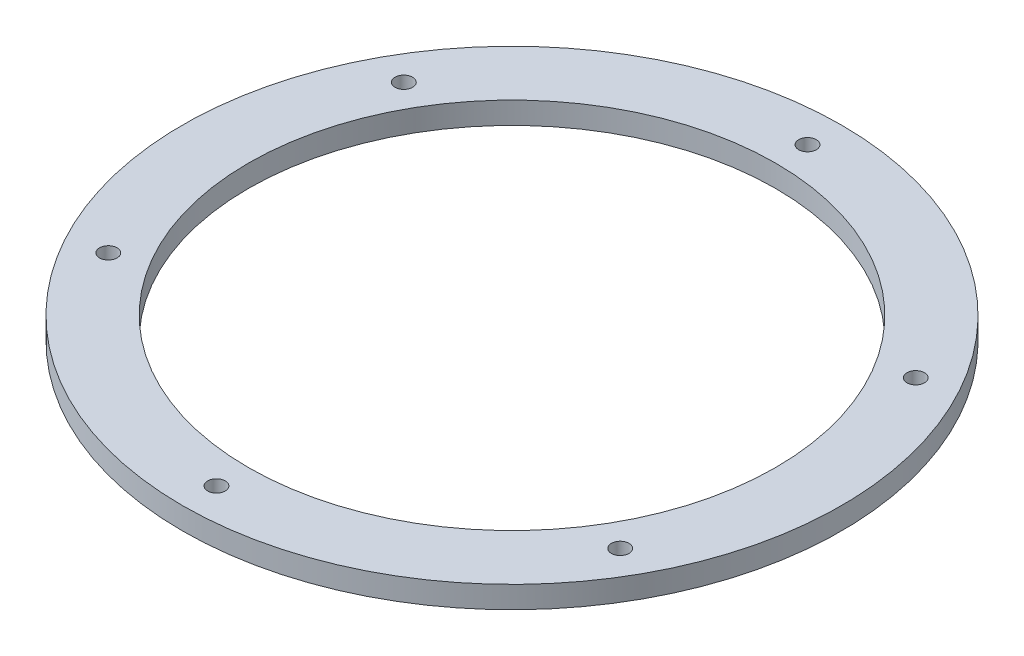
ISO-10303-21;
HEADER;
FILE_DESCRIPTION(('STEP AP214'),'2;1');
FILE_NAME('part.step','',(''),(''),'','','');
FILE_SCHEMA(('AUTOMOTIVE_DESIGN { 1 0 10303 214 1 1 1 1 }'));
ENDSEC;
DATA;
#1=APPLICATION_CONTEXT('core data for automotive mechanical design processes');
#2=APPLICATION_PROTOCOL_DEFINITION('international standard','automotive_design',2000,#1);
#3=PRODUCT_CONTEXT('',#1,'mechanical');
#4=PRODUCT('Part','Part','',(#3));
#5=PRODUCT_RELATED_PRODUCT_CATEGORY('part','',(#4));
#6=PRODUCT_DEFINITION_FORMATION('','',#4);
#7=PRODUCT_DEFINITION_CONTEXT('part definition',#1,'design');
#8=PRODUCT_DEFINITION('design','',#6,#7);
#9=PRODUCT_DEFINITION_SHAPE('','',#8);
#10=(LENGTH_UNIT() NAMED_UNIT(*) SI_UNIT(.MILLI.,.METRE.));
#11=(NAMED_UNIT(*) PLANE_ANGLE_UNIT() SI_UNIT($,.RADIAN.));
#12=(NAMED_UNIT(*) SI_UNIT($,.STERADIAN.) SOLID_ANGLE_UNIT());
#13=UNCERTAINTY_MEASURE_WITH_UNIT(LENGTH_MEASURE(1.E-05),#10,'distance_accuracy_value','');
#14=(GEOMETRIC_REPRESENTATION_CONTEXT(3) GLOBAL_UNCERTAINTY_ASSIGNED_CONTEXT((#13)) GLOBAL_UNIT_ASSIGNED_CONTEXT((#10,
#11,#12)) REPRESENTATION_CONTEXT('',''));
#15=CARTESIAN_POINT('',(0.,0.,0.));
#16=DIRECTION('',(0.,0.,1.));
#17=DIRECTION('',(1.,0.,0.));
#18=AXIS2_PLACEMENT_3D('',#15,#16,#17);
#19=CARTESIAN_POINT('',(0.,5.,0.));
#20=DIRECTION('',(0.,1.,0.));
#21=DIRECTION('',(0.,0.,1.));
#22=AXIS2_PLACEMENT_3D('',#19,#20,#21);
#23=PLANE('',#22);
#24=CARTESIAN_POINT('',(0.,5.,-67.2540619190158));
#25=DIRECTION('',(0.,1.,0.));
#26=DIRECTION('',(0.,0.,1.));
#27=AXIS2_PLACEMENT_3D('',#24,#25,#26);
#28=CIRCLE('',#27,2.);
#29=CARTESIAN_POINT('',(0.,5.,-65.2540619190158));
#30=VERTEX_POINT('',#29);
#31=EDGE_CURVE('E99',#30,#30,#28,.T.);
#32=ORIENTED_EDGE('',*,*,#31,.F.);
#33=EDGE_LOOP('',(#32));
#34=FACE_BOUND('',#33,.T.);
#35=CARTESIAN_POINT('',(-58.243726129559,5.,-33.6270309595086));
#36=DIRECTION('',(0.,1.,0.));
#37=DIRECTION('',(0.,0.,1.));
#38=AXIS2_PLACEMENT_3D('',#35,#36,#37);
#39=CIRCLE('',#38,2.00000000000001);
#40=CARTESIAN_POINT('',(-58.243726129559,5.,-31.6270309595086));
#41=VERTEX_POINT('',#40);
#42=EDGE_CURVE('E71',#41,#41,#39,.T.);
#43=ORIENTED_EDGE('',*,*,#42,.F.);
#44=EDGE_LOOP('',(#43));
#45=FACE_BOUND('',#44,.T.);
#46=CARTESIAN_POINT('',(-58.2437261295596,5.,33.6270309595074));
#47=DIRECTION('',(0.,1.,0.));
#48=DIRECTION('',(0.,0.,1.));
#49=AXIS2_PLACEMENT_3D('',#46,#47,#48);
#50=CIRCLE('',#49,2.);
#51=CARTESIAN_POINT('',(-58.2437261295596,5.,35.6270309595074));
#52=VERTEX_POINT('',#51);
#53=EDGE_CURVE('E70',#52,#52,#50,.T.);
#54=ORIENTED_EDGE('',*,*,#53,.F.);
#55=EDGE_LOOP('',(#54));
#56=FACE_BOUND('',#55,.T.);
#57=CARTESIAN_POINT('',(-4.44749365667771E-13,5.,67.2540619190158));
#58=DIRECTION('',(0.,1.,0.));
#59=DIRECTION('',(0.,0.,1.));
#60=AXIS2_PLACEMENT_3D('',#57,#58,#59);
#61=CIRCLE('',#60,2.);
#62=CARTESIAN_POINT('',(-4.44749365667771E-13,5.,69.2540619190158));
#63=VERTEX_POINT('',#62);
#64=EDGE_CURVE('E79',#63,#63,#61,.T.);
#65=ORIENTED_EDGE('',*,*,#64,.F.);
#66=EDGE_LOOP('',(#65));
#67=FACE_BOUND('',#66,.T.);
#68=CARTESIAN_POINT('',(58.2437261295592,5.,33.6270309595082));
#69=DIRECTION('',(0.,1.,0.));
#70=DIRECTION('',(0.,0.,1.));
#71=AXIS2_PLACEMENT_3D('',#68,#69,#70);
#72=CIRCLE('',#71,2.);
#73=CARTESIAN_POINT('',(58.2437261295592,5.,35.6270309595082));
#74=VERTEX_POINT('',#73);
#75=EDGE_CURVE('E87',#74,#74,#72,.T.);
#76=ORIENTED_EDGE('',*,*,#75,.F.);
#77=EDGE_LOOP('',(#76));
#78=FACE_BOUND('',#77,.T.);
#79=CARTESIAN_POINT('',(58.2437261295594,5.,-33.6270309595078));
#80=DIRECTION('',(0.,1.,0.));
#81=DIRECTION('',(0.,0.,1.));
#82=AXIS2_PLACEMENT_3D('',#79,#80,#81);
#83=CIRCLE('',#82,2.00000000000001);
#84=CARTESIAN_POINT('',(58.2437261295594,5.,-31.6270309595078));
#85=VERTEX_POINT('',#84);
#86=EDGE_CURVE('E95',#85,#85,#83,.T.);
#87=ORIENTED_EDGE('',*,*,#86,.F.);
#88=EDGE_LOOP('',(#87));
#89=FACE_BOUND('',#88,.T.);
#90=CARTESIAN_POINT('',(0.,5.,0.));
#91=DIRECTION('',(0.,1.,0.));
#92=DIRECTION('',(0.,0.,1.));
#93=AXIS2_PLACEMENT_3D('',#90,#91,#92);
#94=CIRCLE('',#93,75.);
#95=CARTESIAN_POINT('',(0.,5.,75.));
#96=VERTEX_POINT('',#95);
#97=EDGE_CURVE('E10',#96,#96,#94,.T.);
#98=ORIENTED_EDGE('',*,*,#97,.T.);
#99=EDGE_LOOP('',(#98));
#100=FACE_BOUND('',#99,.T.);
#101=CARTESIAN_POINT('',(0.,5.,0.));
#102=DIRECTION('',(0.,1.,0.));
#103=DIRECTION('',(0.,0.,1.));
#104=AXIS2_PLACEMENT_3D('',#101,#102,#103);
#105=CIRCLE('',#104,60.);
#106=CARTESIAN_POINT('',(0.,5.,60.));
#107=VERTEX_POINT('',#106);
#108=EDGE_CURVE('E56',#107,#107,#105,.T.);
#109=ORIENTED_EDGE('',*,*,#108,.F.);
#110=EDGE_LOOP('',(#109));
#111=FACE_BOUND('',#110,.T.);
#112=ADVANCED_FACE('F43',(#34,#45,#56,#67,#78,#89,#100,#111),#23,.T.);
#113=CARTESIAN_POINT('',(0.,0.,0.));
#114=DIRECTION('',(0.,1.,0.));
#115=DIRECTION('',(0.,0.,1.));
#116=AXIS2_PLACEMENT_3D('',#113,#114,#115);
#117=PLANE('',#116);
#118=CARTESIAN_POINT('',(0.,0.,-67.2540619190158));
#119=DIRECTION('',(0.,1.,0.));
#120=DIRECTION('',(0.,0.,1.));
#121=AXIS2_PLACEMENT_3D('',#118,#119,#120);
#122=CIRCLE('',#121,2.);
#123=CARTESIAN_POINT('',(0.,0.,-65.2540619190158));
#124=VERTEX_POINT('',#123);
#125=EDGE_CURVE('E62',#124,#124,#122,.T.);
#126=ORIENTED_EDGE('',*,*,#125,.T.);
#127=EDGE_LOOP('',(#126));
#128=FACE_BOUND('',#127,.T.);
#129=CARTESIAN_POINT('',(-58.243726129559,0.,-33.6270309595086));
#130=DIRECTION('',(0.,1.,0.));
#131=DIRECTION('',(0.,0.,1.));
#132=AXIS2_PLACEMENT_3D('',#129,#130,#131);
#133=CIRCLE('',#132,2.00000000000001);
#134=CARTESIAN_POINT('',(-58.243726129559,0.,-31.6270309595086));
#135=VERTEX_POINT('',#134);
#136=EDGE_CURVE('E100',#135,#135,#133,.T.);
#137=ORIENTED_EDGE('',*,*,#136,.T.);
#138=EDGE_LOOP('',(#137));
#139=FACE_BOUND('',#138,.T.);
#140=CARTESIAN_POINT('',(-58.2437261295596,0.,33.6270309595074));
#141=DIRECTION('',(0.,1.,0.));
#142=DIRECTION('',(0.,0.,1.));
#143=AXIS2_PLACEMENT_3D('',#140,#141,#142);
#144=CIRCLE('',#143,2.);
#145=CARTESIAN_POINT('',(-58.2437261295596,0.,35.6270309595074));
#146=VERTEX_POINT('',#145);
#147=EDGE_CURVE('E66',#146,#146,#144,.T.);
#148=ORIENTED_EDGE('',*,*,#147,.T.);
#149=EDGE_LOOP('',(#148));
#150=FACE_BOUND('',#149,.T.);
#151=CARTESIAN_POINT('',(-4.44749365667771E-13,0.,67.2540619190158));
#152=DIRECTION('',(0.,1.,0.));
#153=DIRECTION('',(0.,0.,1.));
#154=AXIS2_PLACEMENT_3D('',#151,#152,#153);
#155=CIRCLE('',#154,2.);
#156=CARTESIAN_POINT('',(-4.44749365667771E-13,0.,69.2540619190158));
#157=VERTEX_POINT('',#156);
#158=EDGE_CURVE('E75',#157,#157,#155,.T.);
#159=ORIENTED_EDGE('',*,*,#158,.T.);
#160=EDGE_LOOP('',(#159));
#161=FACE_BOUND('',#160,.T.);
#162=CARTESIAN_POINT('',(58.2437261295592,0.,33.6270309595082));
#163=DIRECTION('',(0.,1.,0.));
#164=DIRECTION('',(0.,0.,1.));
#165=AXIS2_PLACEMENT_3D('',#162,#163,#164);
#166=CIRCLE('',#165,2.);
#167=CARTESIAN_POINT('',(58.2437261295592,0.,35.6270309595082));
#168=VERTEX_POINT('',#167);
#169=EDGE_CURVE('E83',#168,#168,#166,.T.);
#170=ORIENTED_EDGE('',*,*,#169,.T.);
#171=EDGE_LOOP('',(#170));
#172=FACE_BOUND('',#171,.T.);
#173=CARTESIAN_POINT('',(58.2437261295594,0.,-33.6270309595078));
#174=DIRECTION('',(0.,1.,0.));
#175=DIRECTION('',(0.,0.,1.));
#176=AXIS2_PLACEMENT_3D('',#173,#174,#175);
#177=CIRCLE('',#176,2.00000000000001);
#178=CARTESIAN_POINT('',(58.2437261295594,0.,-31.6270309595078));
#179=VERTEX_POINT('',#178);
#180=EDGE_CURVE('E91',#179,#179,#177,.T.);
#181=ORIENTED_EDGE('',*,*,#180,.T.);
#182=EDGE_LOOP('',(#181));
#183=FACE_BOUND('',#182,.T.);
#184=CARTESIAN_POINT('',(0.,0.,0.));
#185=DIRECTION('',(0.,1.,0.));
#186=DIRECTION('',(0.,0.,1.));
#187=AXIS2_PLACEMENT_3D('',#184,#185,#186);
#188=CIRCLE('',#187,75.);
#189=CARTESIAN_POINT('',(0.,0.,75.));
#190=VERTEX_POINT('',#189);
#191=EDGE_CURVE('E47',#190,#190,#188,.T.);
#192=ORIENTED_EDGE('',*,*,#191,.F.);
#193=EDGE_LOOP('',(#192));
#194=FACE_BOUND('',#193,.T.);
#195=CARTESIAN_POINT('',(0.,0.,0.));
#196=DIRECTION('',(0.,1.,0.));
#197=DIRECTION('',(0.,0.,1.));
#198=AXIS2_PLACEMENT_3D('',#195,#196,#197);
#199=CIRCLE('',#198,60.);
#200=CARTESIAN_POINT('',(0.,0.,60.));
#201=VERTEX_POINT('',#200);
#202=EDGE_CURVE('E58',#201,#201,#199,.T.);
#203=ORIENTED_EDGE('',*,*,#202,.T.);
#204=EDGE_LOOP('',(#203));
#205=FACE_BOUND('',#204,.T.);
#206=ADVANCED_FACE('F114',(#128,#139,#150,#161,#172,#183,#194,#205),#117,.F.);
#207=CARTESIAN_POINT('',(0.,5.,0.));
#208=DIRECTION('',(0.,-1.,0.));
#209=DIRECTION('',(0.,0.,-1.));
#210=AXIS2_PLACEMENT_3D('',#207,#208,#209);
#211=CYLINDRICAL_SURFACE('',#210,75.);
#212=ORIENTED_EDGE('',*,*,#97,.F.);
#213=EDGE_LOOP('',(#212));
#214=FACE_BOUND('',#213,.T.);
#215=ORIENTED_EDGE('',*,*,#191,.T.);
#216=EDGE_LOOP('',(#215));
#217=FACE_BOUND('',#216,.T.);
#218=ADVANCED_FACE('F45',(#214,#217),#211,.T.);
#219=CARTESIAN_POINT('',(0.,5.,0.));
#220=DIRECTION('',(0.,-1.,0.));
#221=DIRECTION('',(0.,0.,-1.));
#222=AXIS2_PLACEMENT_3D('',#219,#220,#221);
#223=CYLINDRICAL_SURFACE('',#222,60.);
#224=ORIENTED_EDGE('',*,*,#108,.T.);
#225=EDGE_LOOP('',(#224));
#226=FACE_BOUND('',#225,.T.);
#227=ORIENTED_EDGE('',*,*,#202,.F.);
#228=EDGE_LOOP('',(#227));
#229=FACE_BOUND('',#228,.T.);
#230=ADVANCED_FACE('F139',(#226,#229),#223,.F.);
#231=CARTESIAN_POINT('',(58.2437261295594,0.,-33.6270309595078));
#232=DIRECTION('',(0.,1.,0.));
#233=DIRECTION('',(0.,0.,1.));
#234=AXIS2_PLACEMENT_3D('',#231,#232,#233);
#235=CYLINDRICAL_SURFACE('',#234,2.00000000000001);
#236=ORIENTED_EDGE('',*,*,#180,.F.);
#237=EDGE_LOOP('',(#236));
#238=FACE_BOUND('',#237,.T.);
#239=ORIENTED_EDGE('',*,*,#86,.T.);
#240=EDGE_LOOP('',(#239));
#241=FACE_BOUND('',#240,.T.);
#242=ADVANCED_FACE('F142',(#238,#241),#235,.F.);
#243=CARTESIAN_POINT('',(58.2437261295592,0.,33.6270309595082));
#244=DIRECTION('',(0.,1.,0.));
#245=DIRECTION('',(0.,0.,1.));
#246=AXIS2_PLACEMENT_3D('',#243,#244,#245);
#247=CYLINDRICAL_SURFACE('',#246,2.);
#248=ORIENTED_EDGE('',*,*,#169,.F.);
#249=EDGE_LOOP('',(#248));
#250=FACE_BOUND('',#249,.T.);
#251=ORIENTED_EDGE('',*,*,#75,.T.);
#252=EDGE_LOOP('',(#251));
#253=FACE_BOUND('',#252,.T.);
#254=ADVANCED_FACE('F160',(#250,#253),#247,.F.);
#255=CARTESIAN_POINT('',(-4.44749365667771E-13,0.,67.2540619190158));
#256=DIRECTION('',(0.,1.,0.));
#257=DIRECTION('',(0.,0.,1.));
#258=AXIS2_PLACEMENT_3D('',#255,#256,#257);
#259=CYLINDRICAL_SURFACE('',#258,2.);
#260=ORIENTED_EDGE('',*,*,#158,.F.);
#261=EDGE_LOOP('',(#260));
#262=FACE_BOUND('',#261,.T.);
#263=ORIENTED_EDGE('',*,*,#64,.T.);
#264=EDGE_LOOP('',(#263));
#265=FACE_BOUND('',#264,.T.);
#266=ADVANCED_FACE('F156',(#262,#265),#259,.F.);
#267=CARTESIAN_POINT('',(-58.2437261295596,0.,33.6270309595074));
#268=DIRECTION('',(0.,1.,0.));
#269=DIRECTION('',(0.,0.,1.));
#270=AXIS2_PLACEMENT_3D('',#267,#268,#269);
#271=CYLINDRICAL_SURFACE('',#270,2.);
#272=ORIENTED_EDGE('',*,*,#147,.F.);
#273=EDGE_LOOP('',(#272));
#274=FACE_BOUND('',#273,.T.);
#275=ORIENTED_EDGE('',*,*,#53,.T.);
#276=EDGE_LOOP('',(#275));
#277=FACE_BOUND('',#276,.T.);
#278=ADVANCED_FACE('F153',(#274,#277),#271,.F.);
#279=CARTESIAN_POINT('',(-58.243726129559,0.,-33.6270309595086));
#280=DIRECTION('',(0.,1.,0.));
#281=DIRECTION('',(0.,0.,1.));
#282=AXIS2_PLACEMENT_3D('',#279,#280,#281);
#283=CYLINDRICAL_SURFACE('',#282,2.00000000000001);
#284=ORIENTED_EDGE('',*,*,#136,.F.);
#285=EDGE_LOOP('',(#284));
#286=FACE_BOUND('',#285,.T.);
#287=ORIENTED_EDGE('',*,*,#42,.T.);
#288=EDGE_LOOP('',(#287));
#289=FACE_BOUND('',#288,.T.);
#290=ADVANCED_FACE('F120',(#286,#289),#283,.F.);
#291=CARTESIAN_POINT('',(0.,0.,-67.2540619190158));
#292=DIRECTION('',(0.,1.,0.));
#293=DIRECTION('',(0.,0.,1.));
#294=AXIS2_PLACEMENT_3D('',#291,#292,#293);
#295=CYLINDRICAL_SURFACE('',#294,2.);
#296=ORIENTED_EDGE('',*,*,#125,.F.);
#297=EDGE_LOOP('',(#296));
#298=FACE_BOUND('',#297,.T.);
#299=ORIENTED_EDGE('',*,*,#31,.T.);
#300=EDGE_LOOP('',(#299));
#301=FACE_BOUND('',#300,.T.);
#302=ADVANCED_FACE('F117',(#298,#301),#295,.F.);
#303=CLOSED_SHELL('',(#112,#206,#218,#230,#242,#254,#266,#278,#290,#302));
#304=MANIFOLD_SOLID_BREP('B2',#303);
#305=ADVANCED_BREP_SHAPE_REPRESENTATION('',(#18,#304),#14);
#306=SHAPE_DEFINITION_REPRESENTATION(#9,#305);
ENDSEC;
END-ISO-10303-21;
